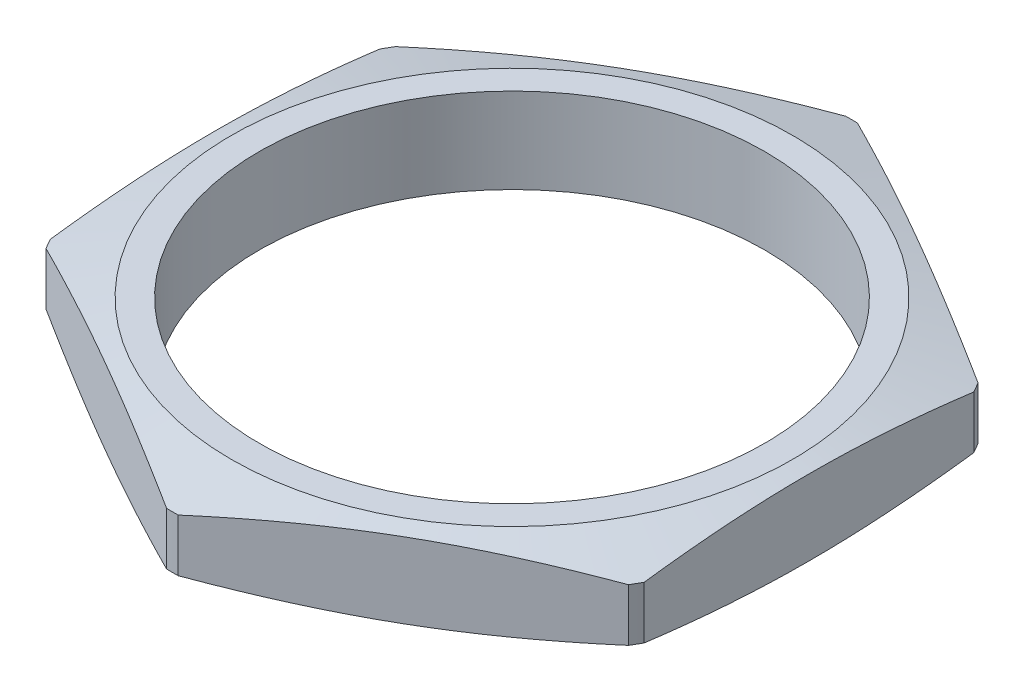
ISO-10303-21;
HEADER;
FILE_DESCRIPTION(('STEP AP214'),'2;1');
FILE_NAME('part.step','',(''),(''),'','','');
FILE_SCHEMA(('AUTOMOTIVE_DESIGN { 1 0 10303 214 1 1 1 1 }'));
ENDSEC;
DATA;
#1=APPLICATION_CONTEXT('core data for automotive mechanical design processes');
#2=APPLICATION_PROTOCOL_DEFINITION('international standard','automotive_design',2000,#1);
#3=PRODUCT_CONTEXT('',#1,'mechanical');
#4=PRODUCT('Part','Part','',(#3));
#5=PRODUCT_RELATED_PRODUCT_CATEGORY('part','',(#4));
#6=PRODUCT_DEFINITION_FORMATION('','',#4);
#7=PRODUCT_DEFINITION_CONTEXT('part definition',#1,'design');
#8=PRODUCT_DEFINITION('design','',#6,#7);
#9=PRODUCT_DEFINITION_SHAPE('','',#8);
#10=(LENGTH_UNIT() NAMED_UNIT(*) SI_UNIT(.MILLI.,.METRE.));
#11=(NAMED_UNIT(*) PLANE_ANGLE_UNIT() SI_UNIT($,.RADIAN.));
#12=(NAMED_UNIT(*) SI_UNIT($,.STERADIAN.) SOLID_ANGLE_UNIT());
#13=UNCERTAINTY_MEASURE_WITH_UNIT(LENGTH_MEASURE(1.E-05),#10,'distance_accuracy_value','');
#14=(GEOMETRIC_REPRESENTATION_CONTEXT(3) GLOBAL_UNCERTAINTY_ASSIGNED_CONTEXT((#13)) GLOBAL_UNIT_ASSIGNED_CONTEXT((#10,
#11,#12)) REPRESENTATION_CONTEXT('',''));
#15=CARTESIAN_POINT('',(0.,0.,0.));
#16=DIRECTION('',(0.,0.,1.));
#17=DIRECTION('',(1.,0.,0.));
#18=AXIS2_PLACEMENT_3D('',#15,#16,#17);
#19=CARTESIAN_POINT('',(0.,2.7,0.));
#20=DIRECTION('',(0.,-1.,0.));
#21=DIRECTION('',(0.,0.,-1.));
#22=AXIS2_PLACEMENT_3D('',#19,#20,#21);
#23=CYLINDRICAL_SURFACE('',#22,10.75);
#24=DIRECTION('',(0.,-1.,0.));
#25=VECTOR('',#24,1.);
#26=CARTESIAN_POINT('',(9.21684347747406,2.7,-5.53283799796667));
#27=LINE('',#26,#25);
#28=CARTESIAN_POINT('',(9.21684347747406,2.2,-5.53283799796667));
#29=VERTEX_POINT('',#28);
#30=CARTESIAN_POINT('',(9.21684347747406,0.535898384862248,-5.53283799796668));
#31=VERTEX_POINT('',#30);
#32=EDGE_CURVE('E369',#29,#31,#27,.T.);
#33=ORIENTED_EDGE('',*,*,#32,.F.);
#34=CARTESIAN_POINT('',(0.,2.2,0.));
#35=DIRECTION('',(0.,1.,0.));
#36=DIRECTION('',(0.,0.,1.));
#37=AXIS2_PLACEMENT_3D('',#34,#35,#36);
#38=CIRCLE('',#37,10.75);
#39=CARTESIAN_POINT('',(9.39999999999999,2.2,-5.21560159521412));
#40=VERTEX_POINT('',#39);
#41=EDGE_CURVE('E350',#29,#40,#38,.F.);
#42=ORIENTED_EDGE('',*,*,#41,.T.);
#43=DIRECTION('',(0.,-1.,0.));
#44=VECTOR('',#43,1.);
#45=CARTESIAN_POINT('',(9.39999999999999,2.7,-5.21560159521412));
#46=LINE('',#45,#44);
#47=CARTESIAN_POINT('',(9.4,0.535898384862248,-5.21560159521412));
#48=VERTEX_POINT('',#47);
#49=EDGE_CURVE('E381',#48,#40,#46,.F.);
#50=ORIENTED_EDGE('',*,*,#49,.F.);
#51=CARTESIAN_POINT('',(0.,0.535898384862248,0.));
#52=DIRECTION('',(0.,1.,0.));
#53=DIRECTION('',(0.,0.,1.));
#54=AXIS2_PLACEMENT_3D('',#51,#52,#53);
#55=CIRCLE('',#54,10.75);
#56=EDGE_CURVE('E173',#48,#31,#55,.T.);
#57=ORIENTED_EDGE('',*,*,#56,.T.);
#58=EDGE_LOOP('',(#33,#42,#50,#57));
#59=FACE_BOUND('',#58,.T.);
#60=ADVANCED_FACE('F46',(#59),#23,.T.);
#61=DIRECTION('',(0.,-1.,0.));
#62=VECTOR('',#61,1.);
#63=CARTESIAN_POINT('',(0.183156522525941,2.7,-10.7484395931808));
#64=LINE('',#63,#62);
#65=CARTESIAN_POINT('',(0.183156522525943,0.535898384862248,-10.7484395931808));
#66=VERTEX_POINT('',#65);
#67=CARTESIAN_POINT('',(0.183156522525941,2.2,-10.7484395931808));
#68=VERTEX_POINT('',#67);
#69=EDGE_CURVE('E269',#66,#68,#64,.F.);
#70=ORIENTED_EDGE('',*,*,#69,.F.);
#71=CARTESIAN_POINT('',(-0.183156522525944,0.535898384862248,-10.7484395931808));
#72=VERTEX_POINT('',#71);
#73=EDGE_CURVE('E168',#66,#72,#55,.T.);
#74=ORIENTED_EDGE('',*,*,#73,.T.);
#75=DIRECTION('',(0.,-1.,0.));
#76=VECTOR('',#75,1.);
#77=CARTESIAN_POINT('',(-0.183156522525941,2.7,-10.7484395931808));
#78=LINE('',#77,#76);
#79=CARTESIAN_POINT('',(-0.183156522525941,2.2,-10.7484395931808));
#80=VERTEX_POINT('',#79);
#81=EDGE_CURVE('E148',#80,#72,#78,.T.);
#82=ORIENTED_EDGE('',*,*,#81,.F.);
#83=EDGE_CURVE('E341',#80,#68,#38,.F.);
#84=ORIENTED_EDGE('',*,*,#83,.T.);
#85=EDGE_LOOP('',(#70,#74,#82,#84));
#86=FACE_BOUND('',#85,.T.);
#87=ADVANCED_FACE('F309',(#86),#23,.T.);
#88=DIRECTION('',(0.,-1.,0.));
#89=VECTOR('',#88,1.);
#90=CARTESIAN_POINT('',(9.39999999999999,2.7,5.21560159521412));
#91=LINE('',#90,#89);
#92=CARTESIAN_POINT('',(9.39999999999999,2.2,5.21560159521412));
#93=VERTEX_POINT('',#92);
#94=CARTESIAN_POINT('',(9.4,0.535898384862248,5.21560159521412));
#95=VERTEX_POINT('',#94);
#96=EDGE_CURVE('E270',#93,#95,#91,.T.);
#97=ORIENTED_EDGE('',*,*,#96,.F.);
#98=CARTESIAN_POINT('',(9.21684347747406,2.2,5.53283799796667));
#99=VERTEX_POINT('',#98);
#100=EDGE_CURVE('E343',#93,#99,#38,.F.);
#101=ORIENTED_EDGE('',*,*,#100,.T.);
#102=DIRECTION('',(0.,-1.,0.));
#103=VECTOR('',#102,1.);
#104=CARTESIAN_POINT('',(9.21684347747406,2.7,5.53283799796667));
#105=LINE('',#104,#103);
#106=CARTESIAN_POINT('',(9.21684347747406,0.535898384862248,5.53283799796667));
#107=VERTEX_POINT('',#106);
#108=EDGE_CURVE('E391',#107,#99,#105,.F.);
#109=ORIENTED_EDGE('',*,*,#108,.F.);
#110=EDGE_CURVE('E181',#107,#95,#55,.T.);
#111=ORIENTED_EDGE('',*,*,#110,.T.);
#112=EDGE_LOOP('',(#97,#101,#109,#111));
#113=FACE_BOUND('',#112,.T.);
#114=ADVANCED_FACE('F314',(#113),#23,.T.);
#115=DIRECTION('',(0.,-1.,0.));
#116=VECTOR('',#115,1.);
#117=CARTESIAN_POINT('',(0.183156522525933,2.7,10.7484395931808));
#118=LINE('',#117,#116);
#119=CARTESIAN_POINT('',(0.183156522525933,2.2,10.7484395931808));
#120=VERTEX_POINT('',#119);
#121=CARTESIAN_POINT('',(0.183156522525938,0.535898384862248,10.7484395931808));
#122=VERTEX_POINT('',#121);
#123=EDGE_CURVE('E397',#120,#122,#118,.T.);
#124=ORIENTED_EDGE('',*,*,#123,.F.);
#125=CARTESIAN_POINT('',(-0.183156522525942,2.2,10.7484395931808));
#126=VERTEX_POINT('',#125);
#127=EDGE_CURVE('E182',#120,#126,#38,.F.);
#128=ORIENTED_EDGE('',*,*,#127,.T.);
#129=DIRECTION('',(0.,-1.,0.));
#130=VECTOR('',#129,1.);
#131=CARTESIAN_POINT('',(-0.183156522525942,2.7,10.7484395931808));
#132=LINE('',#131,#130);
#133=CARTESIAN_POINT('',(-0.183156522525943,0.535898384862247,10.7484395931808));
#134=VERTEX_POINT('',#133);
#135=EDGE_CURVE('E332',#134,#126,#132,.F.);
#136=ORIENTED_EDGE('',*,*,#135,.F.);
#137=EDGE_CURVE('E175',#134,#122,#55,.T.);
#138=ORIENTED_EDGE('',*,*,#137,.T.);
#139=EDGE_LOOP('',(#124,#128,#136,#138));
#140=FACE_BOUND('',#139,.T.);
#141=ADVANCED_FACE('F322',(#140),#23,.T.);
#142=DIRECTION('',(0.,-1.,0.));
#143=VECTOR('',#142,1.);
#144=CARTESIAN_POINT('',(-9.21684347747406,2.7,5.53283799796667));
#145=LINE('',#144,#143);
#146=CARTESIAN_POINT('',(-9.21684347747406,2.2,5.53283799796667));
#147=VERTEX_POINT('',#146);
#148=CARTESIAN_POINT('',(-9.21684347747406,0.535898384862248,5.53283799796667));
#149=VERTEX_POINT('',#148);
#150=EDGE_CURVE('E69',#147,#149,#145,.T.);
#151=ORIENTED_EDGE('',*,*,#150,.F.);
#152=CARTESIAN_POINT('',(-9.4,2.2,5.21560159521411));
#153=VERTEX_POINT('',#152);
#154=EDGE_CURVE('E180',#147,#153,#38,.F.);
#155=ORIENTED_EDGE('',*,*,#154,.T.);
#156=DIRECTION('',(0.,-1.,0.));
#157=VECTOR('',#156,1.);
#158=CARTESIAN_POINT('',(-9.4,2.7,5.21560159521411));
#159=LINE('',#158,#157);
#160=CARTESIAN_POINT('',(-9.4,0.535898384862248,5.21560159521411));
#161=VERTEX_POINT('',#160);
#162=EDGE_CURVE('E217',#161,#153,#159,.F.);
#163=ORIENTED_EDGE('',*,*,#162,.F.);
#164=EDGE_CURVE('E169',#161,#149,#55,.T.);
#165=ORIENTED_EDGE('',*,*,#164,.T.);
#166=EDGE_LOOP('',(#151,#155,#163,#165));
#167=FACE_BOUND('',#166,.T.);
#168=ADVANCED_FACE('F318',(#167),#23,.T.);
#169=DIRECTION('',(0.,-1.,0.));
#170=VECTOR('',#169,1.);
#171=CARTESIAN_POINT('',(-9.4,2.7,-5.21560159521411));
#172=LINE('',#171,#170);
#173=CARTESIAN_POINT('',(-9.4,2.2,-5.21560159521411));
#174=VERTEX_POINT('',#173);
#175=CARTESIAN_POINT('',(-9.4,0.535898384862248,-5.21560159521411));
#176=VERTEX_POINT('',#175);
#177=EDGE_CURVE('E77',#174,#176,#172,.T.);
#178=ORIENTED_EDGE('',*,*,#177,.F.);
#179=CARTESIAN_POINT('',(-9.21684347747406,2.2,-5.53283799796667));
#180=VERTEX_POINT('',#179);
#181=EDGE_CURVE('E163',#174,#180,#38,.F.);
#182=ORIENTED_EDGE('',*,*,#181,.T.);
#183=DIRECTION('',(0.,-1.,0.));
#184=VECTOR('',#183,1.);
#185=CARTESIAN_POINT('',(-9.21684347747406,2.7,-5.53283799796667));
#186=LINE('',#185,#184);
#187=CARTESIAN_POINT('',(-9.21684347747406,0.535898384862248,-5.53283799796667));
#188=VERTEX_POINT('',#187);
#189=EDGE_CURVE('E145',#188,#180,#186,.F.);
#190=ORIENTED_EDGE('',*,*,#189,.F.);
#191=EDGE_CURVE('E161',#188,#176,#55,.T.);
#192=ORIENTED_EDGE('',*,*,#191,.T.);
#193=EDGE_LOOP('',(#178,#182,#190,#192));
#194=FACE_BOUND('',#193,.T.);
#195=ADVANCED_FACE('F160',(#194),#23,.T.);
#196=CARTESIAN_POINT('',(0.,2.7,0.));
#197=DIRECTION('',(0.,-1.,0.));
#198=DIRECTION('',(0.,0.,-1.));
#199=AXIS2_PLACEMENT_3D('',#196,#197,#198);
#200=CONICAL_SURFACE('',#199,8.88397459621558,1.30899693899575);
#201=CARTESIAN_POINT('',(0.,2.7,0.));
#202=DIRECTION('',(0.,1.,0.));
#203=DIRECTION('',(0.,0.,1.));
#204=AXIS2_PLACEMENT_3D('',#201,#202,#203);
#205=CIRCLE('',#204,8.88397459621558);
#206=CARTESIAN_POINT('',(0.,2.7,8.88397459621558));
#207=VERTEX_POINT('',#206);
#208=EDGE_CURVE('E344',#207,#207,#205,.T.);
#209=ORIENTED_EDGE('',*,*,#208,.F.);
#210=EDGE_LOOP('',(#209));
#211=FACE_BOUND('',#210,.T.);
#212=ORIENTED_EDGE('',*,*,#41,.F.);
#213=CARTESIAN_POINT('',(9.21817565857168,2.19979999999985,-5.53206886285135));
#214=CARTESIAN_POINT('',(8.84285593275891,2.25617954736137,-5.74875980758153));
#215=CARTESIAN_POINT('',(8.46688465815857,2.30724528726111,-5.9658269241796));
#216=CARTESIAN_POINT('',(7.7136957121978,2.39682133169059,-6.4006807648807));
#217=CARTESIAN_POINT('',(7.33647764725926,2.43532719201803,-6.61846771621616));
#218=CARTESIAN_POINT('',(6.58293661259939,2.49766256051647,-7.05352483542247));
#219=CARTESIAN_POINT('',(6.20661808338529,2.52156186810128,-7.27079243956527));
#220=CARTESIAN_POINT('',(5.45353297873627,2.55359496638114,-7.70558632745708));
#221=CARTESIAN_POINT('',(5.07676648936839,2.56173140978201,-7.92311256151526));
#222=CARTESIAN_POINT('',(4.32323351063263,2.56173140978203,-8.35816502963161));
#223=CARTESIAN_POINT('',(3.94646702126476,2.55359496638117,-8.57569126368978));
#224=CARTESIAN_POINT('',(3.19338191661573,2.52156186810134,-9.01048515158159));
#225=CARTESIAN_POINT('',(2.81706338740163,2.49766256051654,-9.2277527557244));
#226=CARTESIAN_POINT('',(2.06352235274176,2.43532719201813,-9.6628098749307));
#227=CARTESIAN_POINT('',(1.68630428780321,2.3968213316907,-9.88059682626616));
#228=CARTESIAN_POINT('',(0.933115341842445,2.30724528726124,-10.3154506669673));
#229=CARTESIAN_POINT('',(0.557144067242105,2.25617954736151,-10.5325177835653));
#230=CARTESIAN_POINT('',(0.181824341429333,2.1998,-10.7492087282955));
#231=B_SPLINE_CURVE_WITH_KNOTS('',3,(#213,#214,#215,#216,#217,#218,#219,#220,#221,#222,#223,
#224,#225,#226,#227,#228,#229,#230),.UNSPECIFIED.,.F.,.F.,(4,2,2,2,2,2,2,2,4),(0.,
1.31115977516494,2.62278299059983,3.92808840162309,5.23317412591315,6.53825985020321,
7.84356526122646,9.15518847666135,10.4663482518263),.UNSPECIFIED.);
#232=EDGE_CURVE('E362',#29,#68,#231,.T.);
#233=ORIENTED_EDGE('',*,*,#232,.T.);
#234=ORIENTED_EDGE('',*,*,#83,.F.);
#235=CARTESIAN_POINT('',(-0.181824341429335,2.1998,-10.7492087282955));
#236=CARTESIAN_POINT('',(-0.557144067242108,2.25617954736151,-10.5325177835653));
#237=CARTESIAN_POINT('',(-0.933115341842449,2.30724528726124,-10.3154506669673));
#238=CARTESIAN_POINT('',(-1.68630428780322,2.3968213316907,-9.88059682626616));
#239=CARTESIAN_POINT('',(-2.06352235274177,2.43532719201813,-9.6628098749307));
#240=CARTESIAN_POINT('',(-2.81706338740163,2.49766256051654,-9.2277527557244));
#241=CARTESIAN_POINT('',(-3.19338191661574,2.52156186810134,-9.01048515158159));
#242=CARTESIAN_POINT('',(-3.94646702126476,2.55359496638117,-8.57569126368978));
#243=CARTESIAN_POINT('',(-4.32323351063264,2.56173140978203,-8.35816502963161));
#244=CARTESIAN_POINT('',(-5.07676648936839,2.56173140978201,-7.92311256151526));
#245=CARTESIAN_POINT('',(-5.45353297873627,2.55359496638114,-7.70558632745708));
#246=CARTESIAN_POINT('',(-6.20661808338529,2.52156186810128,-7.27079243956527));
#247=CARTESIAN_POINT('',(-6.58293661259939,2.49766256051647,-7.05352483542247));
#248=CARTESIAN_POINT('',(-7.33647764725926,2.43532719201803,-6.61846771621617));
#249=CARTESIAN_POINT('',(-7.71369571219781,2.39682133169059,-6.4006807648807));
#250=CARTESIAN_POINT('',(-8.46688465815857,2.30724528726111,-5.9658269241796));
#251=CARTESIAN_POINT('',(-8.84285593275891,2.25617954736136,-5.74875980758153));
#252=CARTESIAN_POINT('',(-9.21817565857168,2.19979999999985,-5.53206886285135));
#253=B_SPLINE_CURVE_WITH_KNOTS('',3,(#235,#236,#237,#238,#239,#240,#241,#242,#243,#244,#245,
#246,#247,#248,#249,#250,#251,#252),.UNSPECIFIED.,.F.,.F.,(4,2,2,2,2,2,2,2,4),(0.,
1.31115977516494,2.62278299059984,3.92808840162309,5.23317412591315,6.53825985020321,
7.84356526122646,9.15518847666135,10.4663482518263),.UNSPECIFIED.);
#254=EDGE_CURVE('E209',#80,#180,#253,.T.);
#255=ORIENTED_EDGE('',*,*,#254,.T.);
#256=ORIENTED_EDGE('',*,*,#181,.F.);
#257=CARTESIAN_POINT('',(-9.4,0.0402913971668657,-16.2929877834868));
#258=CARTESIAN_POINT('',(-9.4,0.131948907352564,-15.8980144268586));
#259=CARTESIAN_POINT('',(-9.4,0.222840393615614,-15.5028615003231));
#260=CARTESIAN_POINT('',(-9.4,0.402745157805587,-14.7121216981159));
#261=CARTESIAN_POINT('',(-9.4,0.491758404463756,-14.3165348153349));
#262=CARTESIAN_POINT('',(-9.4,0.667575658993785,-13.5247834563603));
#263=CARTESIAN_POINT('',(-9.4,0.754379205550519,-13.1286188775206));
#264=CARTESIAN_POINT('',(-9.4,0.925303142436334,-12.3357116097779));
#265=CARTESIAN_POINT('',(-9.4,1.00942354178585,-11.9389689228231));
#266=CARTESIAN_POINT('',(-9.4,1.17518690057416,-11.1411228842426));
#267=CARTESIAN_POINT('',(-9.4,1.25679962354083,-10.740013233621));
#268=CARTESIAN_POINT('',(-9.4,1.41600070863396,-9.93699679154388));
#269=CARTESIAN_POINT('',(-9.4,1.4935891041085,-9.53509000672261));
#270=CARTESIAN_POINT('',(-9.4,1.64385492432274,-8.73031196645773));
#271=CARTESIAN_POINT('',(-9.4,1.71653183596713,-8.32744061478535));
#272=CARTESIAN_POINT('',(-9.4,1.85586508558543,-7.52065201944612));
#273=CARTESIAN_POINT('',(-9.4,1.9225214263472,-7.11673477626365));
#274=CARTESIAN_POINT('',(-9.4,2.04679588917835,-6.31862022101853));
#275=CARTESIAN_POINT('',(-9.4,2.10460878186919,-5.92445344789568));
#276=CARTESIAN_POINT('',(-9.4,2.21186746932486,-5.13497265623331));
#277=CARTESIAN_POINT('',(-9.4,2.26131326679699,-4.73965863806503));
#278=CARTESIAN_POINT('',(-9.4,2.35029240342197,-3.9480089900364));
#279=CARTESIAN_POINT('',(-9.4,2.38982834461796,-3.5516736560152));
#280=CARTESIAN_POINT('',(-9.4,2.4574890151694,-2.75802170707514));
#281=CARTESIAN_POINT('',(-9.4,2.48561389445317,-2.36070510511801));
#282=CARTESIAN_POINT('',(-9.4,2.52908169615286,-1.56708715698945));
#283=CARTESIAN_POINT('',(-9.4,2.54447941365033,-1.17078885946876));
#284=CARTESIAN_POINT('',(-9.4,2.56192040757687,-0.377895183385455));
#285=CARTESIAN_POINT('',(-9.4,2.56396373734748,0.0187001939842057));
#286=CARTESIAN_POINT('',(-9.4,2.55458671479372,0.81176028898685));
#287=CARTESIAN_POINT('',(-9.4,2.54316532862296,1.20822499424846));
#288=CARTESIAN_POINT('',(-9.4,2.50744959332257,2.00056039698522));
#289=CARTESIAN_POINT('',(-9.4,2.48315526970385,2.39643109563599));
#290=CARTESIAN_POINT('',(-9.4,2.40995679198722,3.35588004723408));
#291=CARTESIAN_POINT('',(-9.4,2.35497616841449,3.9189946353878));
#292=CARTESIAN_POINT('',(-9.4,2.22541048491539,5.04287413671415));
#293=CARTESIAN_POINT('',(-9.4,2.15082622147521,5.60363914440888));
#294=CARTESIAN_POINT('',(-9.4,1.98612941500019,6.72464579835983));
#295=CARTESIAN_POINT('',(-9.4,1.89596895548622,7.2848803010385));
#296=CARTESIAN_POINT('',(-9.4,1.70396046981207,8.40331578338519));
#297=CARTESIAN_POINT('',(-9.4,1.60211250235808,8.96151677325297));
#298=CARTESIAN_POINT('',(-9.4,1.38741409090439,10.0876179020433));
#299=CARTESIAN_POINT('',(-9.4,1.27438126989891,10.655483006204));
#300=CARTESIAN_POINT('',(-9.4,1.04137802764768,11.7897861015187));
#301=CARTESIAN_POINT('',(-9.4,0.921407530883618,12.3562240770681));
#302=CARTESIAN_POINT('',(-9.4,0.676837782139774,13.4849161501699));
#303=CARTESIAN_POINT('',(-9.4,0.552266801782215,14.0471763950469));
#304=CARTESIAN_POINT('',(-9.4,0.362379227403672,14.8898610632136));
#305=CARTESIAN_POINT('',(-9.4,0.29858034424472,15.1706290670438));
#306=CARTESIAN_POINT('',(-9.4,0.170082842648603,15.7319577954584));
#307=CARTESIAN_POINT('',(-9.4,0.105384228408237,16.0125185210034));
#308=CARTESIAN_POINT('',(-9.4,0.0402913971668662,16.2929877834868));
#309=B_SPLINE_CURVE_WITH_KNOTS('',3,(#257,#258,#259,#260,#261,#262,#263,#264,#265,#266,#267,
#268,#269,#270,#271,#272,#273,#274,#275,#276,#277,#278,#279,#280,#281,#282,#283,#284,#285,#286,
#287,#288,#289,#290,#291,#292,#293,#294,#295,#296,#297,#298,#299,#300,#301,#302,#303,#304,#305,
#306,#307,#308),.UNSPECIFIED.,.F.,.F.,(4,2,2,2,2,2,2,2,2,2,2,2,2,2,2,2,2,2,2,2,2,2,2,2,2,4),(0.,
1.21640864830064,2.43283753130567,3.6495183172138,4.86619501234889,6.09416292377924,
7.3221206578789,8.55020647719324,9.77829172783431,10.9733694684506,12.1684468223815,
13.363210053894,14.5579575870745,15.7475341008772,16.9371058631411,18.1267689689269,
19.3164297171103,21.0133489161472,22.7101991808514,24.4123655056298,26.1145232808263,
27.8514825733796,29.5884607767233,31.3161244338548,32.1798991607187,33.0436698598511),.UNSPECIFIED.);
#310=EDGE_CURVE('E234',#174,#153,#309,.T.);
#311=ORIENTED_EDGE('',*,*,#310,.T.);
#312=ORIENTED_EDGE('',*,*,#154,.F.);
#313=CARTESIAN_POINT('',(-9.21817565857168,2.19979999999985,5.53206886285135));
#314=CARTESIAN_POINT('',(-8.84285593275891,2.25617954736137,5.74875980758153));
#315=CARTESIAN_POINT('',(-8.46688465815857,2.30724528726111,5.9658269241796));
#316=CARTESIAN_POINT('',(-7.7136957121978,2.39682133169059,6.4006807648807));
#317=CARTESIAN_POINT('',(-7.33647764725925,2.43532719201803,6.61846771621616));
#318=CARTESIAN_POINT('',(-6.58293661259939,2.49766256051647,7.05352483542247));
#319=CARTESIAN_POINT('',(-6.20661808338529,2.52156186810128,7.27079243956527));
#320=CARTESIAN_POINT('',(-5.45353297873627,2.55359496638114,7.70558632745708));
#321=CARTESIAN_POINT('',(-5.07676648936839,2.56173140978201,7.92311256151526));
#322=CARTESIAN_POINT('',(-4.32323351063263,2.56173140978203,8.35816502963161));
#323=CARTESIAN_POINT('',(-3.94646702126476,2.55359496638117,8.57569126368978));
#324=CARTESIAN_POINT('',(-3.19338191661573,2.52156186810134,9.01048515158159));
#325=CARTESIAN_POINT('',(-2.81706338740163,2.49766256051654,9.2277527557244));
#326=CARTESIAN_POINT('',(-2.06352235274176,2.43532719201813,9.6628098749307));
#327=CARTESIAN_POINT('',(-1.68630428780321,2.3968213316907,9.88059682626616));
#328=CARTESIAN_POINT('',(-0.933115341842444,2.30724528726124,10.3154506669673));
#329=CARTESIAN_POINT('',(-0.557144067242103,2.25617954736151,10.5325177835653));
#330=CARTESIAN_POINT('',(-0.181824341429331,2.1998,10.7492087282955));
#331=B_SPLINE_CURVE_WITH_KNOTS('',3,(#313,#314,#315,#316,#317,#318,#319,#320,#321,#322,#323,
#324,#325,#326,#327,#328,#329,#330),.UNSPECIFIED.,.F.,.F.,(4,2,2,2,2,2,2,2,4),(0.,
1.31115977516494,2.62278299059983,3.92808840162309,5.23317412591315,6.53825985020321,
7.84356526122646,9.15518847666135,10.4663482518263),.UNSPECIFIED.);
#332=EDGE_CURVE('E242',#147,#126,#331,.T.);
#333=ORIENTED_EDGE('',*,*,#332,.T.);
#334=ORIENTED_EDGE('',*,*,#127,.F.);
#335=CARTESIAN_POINT('',(0.18182434142933,2.1998,10.7492087282955));
#336=CARTESIAN_POINT('',(0.557144067242101,2.25617954736151,10.5325177835653));
#337=CARTESIAN_POINT('',(0.933115341842443,2.30724528726124,10.3154506669673));
#338=CARTESIAN_POINT('',(1.68630428780321,2.3968213316907,9.88059682626616));
#339=CARTESIAN_POINT('',(2.06352235274176,2.43532719201813,9.6628098749307));
#340=CARTESIAN_POINT('',(2.81706338740163,2.49766256051654,9.2277527557244));
#341=CARTESIAN_POINT('',(3.19338191661573,2.52156186810134,9.01048515158159));
#342=CARTESIAN_POINT('',(3.94646702126476,2.55359496638117,8.57569126368978));
#343=CARTESIAN_POINT('',(4.32323351063263,2.56173140978203,8.35816502963161));
#344=CARTESIAN_POINT('',(5.07676648936839,2.56173140978201,7.92311256151526));
#345=CARTESIAN_POINT('',(5.45353297873626,2.55359496638114,7.70558632745708));
#346=CARTESIAN_POINT('',(6.20661808338529,2.52156186810128,7.27079243956527));
#347=CARTESIAN_POINT('',(6.58293661259939,2.49766256051647,7.05352483542247));
#348=CARTESIAN_POINT('',(7.33647764725925,2.43532719201803,6.61846771621617));
#349=CARTESIAN_POINT('',(7.7136957121978,2.39682133169059,6.40068076488071));
#350=CARTESIAN_POINT('',(8.46688465815857,2.30724528726111,5.96582692417961));
#351=CARTESIAN_POINT('',(8.84285593275891,2.25617954736137,5.74875980758154));
#352=CARTESIAN_POINT('',(9.21817565857168,2.19979999999985,5.53206886285135));
#353=B_SPLINE_CURVE_WITH_KNOTS('',3,(#335,#336,#337,#338,#339,#340,#341,#342,#343,#344,#345,
#346,#347,#348,#349,#350,#351,#352),.UNSPECIFIED.,.F.,.F.,(4,2,2,2,2,2,2,2,4),(0.,
1.31115977516494,2.62278299059984,3.92808840162309,5.23317412591315,6.53825985020321,
7.84356526122646,9.15518847666135,10.4663482518263),.UNSPECIFIED.);
#354=EDGE_CURVE('E250',#120,#99,#353,.T.);
#355=ORIENTED_EDGE('',*,*,#354,.T.);
#356=ORIENTED_EDGE('',*,*,#100,.F.);
#357=CARTESIAN_POINT('',(9.4,0.0402913971668642,16.2929877834868));
#358=CARTESIAN_POINT('',(9.4,0.131948907352563,15.8980144268587));
#359=CARTESIAN_POINT('',(9.4,0.222840393615612,15.5028615003231));
#360=CARTESIAN_POINT('',(9.4,0.402745157805585,14.7121216981159));
#361=CARTESIAN_POINT('',(9.4,0.491758404463754,14.3165348153349));
#362=CARTESIAN_POINT('',(9.4,0.667575658993784,13.5247834563603));
#363=CARTESIAN_POINT('',(9.4,0.754379205550518,13.1286188775206));
#364=CARTESIAN_POINT('',(9.4,0.925303142436333,12.3357116097779));
#365=CARTESIAN_POINT('',(9.4,1.00942354178585,11.9389689228231));
#366=CARTESIAN_POINT('',(9.4,1.17518690057416,11.1411228842426));
#367=CARTESIAN_POINT('',(9.4,1.25679962354083,10.740013233621));
#368=CARTESIAN_POINT('',(9.4,1.41600070863396,9.93699679154388));
#369=CARTESIAN_POINT('',(9.4,1.4935891041085,9.53509000672262));
#370=CARTESIAN_POINT('',(9.4,1.64385492432273,8.73031196645774));
#371=CARTESIAN_POINT('',(9.4,1.71653183596713,8.32744061478536));
#372=CARTESIAN_POINT('',(9.4,1.85586508558543,7.52065201944612));
#373=CARTESIAN_POINT('',(9.4,1.9225214263472,7.11673477626366));
#374=CARTESIAN_POINT('',(9.4,2.04679588917835,6.31862022101853));
#375=CARTESIAN_POINT('',(9.4,2.10460878186919,5.92445344789569));
#376=CARTESIAN_POINT('',(9.4,2.21186746932486,5.13497265623332));
#377=CARTESIAN_POINT('',(9.4,2.26131326679699,4.73965863806504));
#378=CARTESIAN_POINT('',(9.4,2.35029240342197,3.9480089900364));
#379=CARTESIAN_POINT('',(9.4,2.38982834461796,3.55167365601521));
#380=CARTESIAN_POINT('',(9.4,2.45748901516941,2.75802170707514));
#381=CARTESIAN_POINT('',(9.4,2.48561389445317,2.36070510511802));
#382=CARTESIAN_POINT('',(9.4,2.52908169615286,1.56708715698945));
#383=CARTESIAN_POINT('',(9.4,2.54447941365033,1.17078885946877));
#384=CARTESIAN_POINT('',(9.4,2.56192040757687,0.377895183385462));
#385=CARTESIAN_POINT('',(9.4,2.56396373734748,-0.0187001939841994));
#386=CARTESIAN_POINT('',(9.4,2.55458671479372,-0.811760288986845));
#387=CARTESIAN_POINT('',(9.4,2.54316532862296,-1.20822499424846));
#388=CARTESIAN_POINT('',(9.4,2.50744959332257,-2.00056039698522));
#389=CARTESIAN_POINT('',(9.4,2.48315526970385,-2.39643109563598));
#390=CARTESIAN_POINT('',(9.4,2.40995679198722,-3.35588004723407));
#391=CARTESIAN_POINT('',(9.4,2.35497616841449,-3.9189946353878));
#392=CARTESIAN_POINT('',(9.4,2.22541048491539,-5.04287413671415));
#393=CARTESIAN_POINT('',(9.4,2.15082622147521,-5.60363914440888));
#394=CARTESIAN_POINT('',(9.4,1.98612941500019,-6.72464579835983));
#395=CARTESIAN_POINT('',(9.4,1.89596895548622,-7.2848803010385));
#396=CARTESIAN_POINT('',(9.4,1.70396046981207,-8.40331578338519));
#397=CARTESIAN_POINT('',(9.4,1.60211250235808,-8.96151677325298));
#398=CARTESIAN_POINT('',(9.4,1.38741409090439,-10.0876179020433));
#399=CARTESIAN_POINT('',(9.4,1.27438126989891,-10.655483006204));
#400=CARTESIAN_POINT('',(9.4,1.04137802764768,-11.7897861015187));
#401=CARTESIAN_POINT('',(9.4,0.921407530883616,-12.3562240770681));
#402=CARTESIAN_POINT('',(9.4,0.676837782139772,-13.4849161501699));
#403=CARTESIAN_POINT('',(9.4,0.552266801782214,-14.0471763950469));
#404=CARTESIAN_POINT('',(9.4,0.362379227403672,-14.8898610632136));
#405=CARTESIAN_POINT('',(9.4,0.29858034424472,-15.1706290670438));
#406=CARTESIAN_POINT('',(9.4,0.170082842648601,-15.7319577954584));
#407=CARTESIAN_POINT('',(9.4,0.105384228408235,-16.0125185210034));
#408=CARTESIAN_POINT('',(9.4,0.0402913971668636,-16.2929877834868));
#409=B_SPLINE_CURVE_WITH_KNOTS('',3,(#357,#358,#359,#360,#361,#362,#363,#364,#365,#366,#367,
#368,#369,#370,#371,#372,#373,#374,#375,#376,#377,#378,#379,#380,#381,#382,#383,#384,#385,#386,
#387,#388,#389,#390,#391,#392,#393,#394,#395,#396,#397,#398,#399,#400,#401,#402,#403,#404,#405,
#406,#407,#408),.UNSPECIFIED.,.F.,.F.,(4,2,2,2,2,2,2,2,2,2,2,2,2,2,2,2,2,2,2,2,2,2,2,2,2,4),(0.,
1.21640864830064,2.43283753130567,3.64951831721381,4.86619501234889,6.09416292377925,
7.3221206578789,8.55020647719324,9.77829172783432,10.9733694684506,12.1684468223815,
13.363210053894,14.5579575870745,15.7475341008772,16.9371058631411,18.1267689689269,
19.3164297171103,21.0133489161472,22.7101991808514,24.4123655056298,26.1145232808263,
27.8514825733796,29.5884607767233,31.3161244338548,32.1798991607187,33.0436698598511),.UNSPECIFIED.);
#410=EDGE_CURVE('E259',#93,#40,#409,.T.);
#411=ORIENTED_EDGE('',*,*,#410,.T.);
#412=EDGE_LOOP('',(#212,#233,#234,#255,#256,#311,#312,#333,#334,#355,#356,#411));
#413=FACE_BOUND('',#412,.T.);
#414=ADVANCED_FACE('F220',(#211,#413),#200,.T.);
#415=CARTESIAN_POINT('',(0.,0.535898384862248,0.));
#416=DIRECTION('',(0.,1.,0.));
#417=DIRECTION('',(0.,0.,1.));
#418=AXIS2_PLACEMENT_3D('',#415,#416,#417);
#419=CONICAL_SURFACE('',#418,10.75,1.30899693899575);
#420=CARTESIAN_POINT('',(0.,0.,0.));
#421=DIRECTION('',(0.,1.,0.));
#422=DIRECTION('',(0.,0.,1.));
#423=AXIS2_PLACEMENT_3D('',#420,#421,#422);
#424=CIRCLE('',#423,8.74999999999997);
#425=CARTESIAN_POINT('',(0.,0.,8.74999999999997));
#426=VERTEX_POINT('',#425);
#427=EDGE_CURVE('E155',#426,#426,#424,.F.);
#428=ORIENTED_EDGE('',*,*,#427,.F.);
#429=EDGE_LOOP('',(#428));
#430=FACE_BOUND('',#429,.T.);
#431=ORIENTED_EDGE('',*,*,#73,.F.);
#432=CARTESIAN_POINT('',(0.181824341429334,0.536098384862248,-10.7492087282955));
#433=CARTESIAN_POINT('',(0.557144067242106,0.479718837500744,-10.5325177835653));
#434=CARTESIAN_POINT('',(0.933115341842446,0.42865309760101,-10.3154506669673));
#435=CARTESIAN_POINT('',(1.68630428780322,0.339077053171557,-9.88059682626616));
#436=CARTESIAN_POINT('',(2.06352235274176,0.300571192844124,-9.6628098749307));
#437=CARTESIAN_POINT('',(2.81706338740163,0.238235824345714,-9.2277527557244));
#438=CARTESIAN_POINT('',(3.19338191661573,0.214336516760919,-9.01048515158159));
#439=CARTESIAN_POINT('',(3.94646702126476,0.182303418481084,-8.57569126368978));
#440=CARTESIAN_POINT('',(4.32323351063263,0.17416697508023,-8.35816502963161));
#441=CARTESIAN_POINT('',(5.07676648936839,0.174166975080244,-7.92311256151526));
#442=CARTESIAN_POINT('',(5.45353297873627,0.182303418481113,-7.70558632745708));
#443=CARTESIAN_POINT('',(6.20661808338529,0.214336516760977,-7.27079243956527));
#444=CARTESIAN_POINT('',(6.58293661259939,0.238235824345785,-7.05352483542247));
#445=CARTESIAN_POINT('',(7.33647764725925,0.300571192844222,-6.61846771621617));
#446=CARTESIAN_POINT('',(7.7136957121978,0.339077053171666,-6.4006807648807));
#447=CARTESIAN_POINT('',(8.46688465815857,0.428653097601142,-5.9658269241796));
#448=CARTESIAN_POINT('',(8.84285593275891,0.479718837500886,-5.74875980758153));
#449=CARTESIAN_POINT('',(9.21817565857168,0.5360983848624,-5.53206886285135));
#450=B_SPLINE_CURVE_WITH_KNOTS('',3,(#432,#433,#434,#435,#436,#437,#438,#439,#440,#441,#442,
#443,#444,#445,#446,#447,#448,#449),.UNSPECIFIED.,.F.,.F.,(4,2,2,2,2,2,2,2,4),(0.,
1.31115977516494,2.62278299059983,3.92808840162309,5.23317412591315,6.53825985020321,
7.84356526122646,9.15518847666135,10.4663482518263),.UNSPECIFIED.);
#451=EDGE_CURVE('E12',#66,#31,#450,.T.);
#452=ORIENTED_EDGE('',*,*,#451,.T.);
#453=ORIENTED_EDGE('',*,*,#56,.F.);
#454=CARTESIAN_POINT('',(9.4,2.69600412177257,-16.2946988636449));
#455=CARTESIAN_POINT('',(9.4,2.60433716395088,-15.899695159342));
#456=CARTESIAN_POINT('',(9.4,2.51343616290401,-15.5045118964283));
#457=CARTESIAN_POINT('',(9.4,2.3335122166858,-14.7137114446263));
#458=CARTESIAN_POINT('',(9.4,2.24448930277223,-14.318094248631));
#459=CARTESIAN_POINT('',(9.4,2.06865255122096,-13.5262823261093));
#460=CARTESIAN_POINT('',(9.4,1.98183917459301,-13.1300874970014));
#461=CARTESIAN_POINT('',(9.4,1.81089538789815,-12.3371197464573));
#462=CARTESIAN_POINT('',(9.4,1.72676496881409,-11.9403468269686));
#463=CARTESIAN_POINT('',(9.4,1.5609810979268,-11.1424392099874));
#464=CARTESIAN_POINT('',(9.4,1.47935788765565,-10.7412982121537));
#465=CARTESIAN_POINT('',(9.4,1.32013563567044,-9.93821906992216));
#466=CARTESIAN_POINT('',(9.4,1.24253656061621,-9.53628093215734));
#467=CARTESIAN_POINT('',(9.4,1.09224920707754,-8.73144012988771));
#468=CARTESIAN_POINT('',(9.4,1.01956144197153,-8.3285373690948));
#469=CARTESIAN_POINT('',(9.4,0.880206381798708,-7.52168589154719));
#470=CARTESIAN_POINT('',(9.4,0.813539083947498,-7.11773717527632));
#471=CARTESIAN_POINT('',(9.4,0.689243199659662,-6.31956150566759));
#472=CARTESIAN_POINT('',(9.4,0.63141982245946,-5.92536509734282));
#473=CARTESIAN_POINT('',(9.4,0.524140351156114,-5.13582487319497));
#474=CARTESIAN_POINT('',(9.4,0.474684254366017,-4.7404810577404));
#475=CARTESIAN_POINT('',(9.4,0.385685018269069,-3.94877160887791));
#476=CARTESIAN_POINT('',(9.4,0.346139276497992,-3.55240627140157));
#477=CARTESIAN_POINT('',(9.4,0.278459925670747,-2.75869403878015));
#478=CARTESIAN_POINT('',(9.4,0.250326166655243,-2.36134715660211));
#479=CARTESIAN_POINT('',(9.4,0.206842082127027,-1.56766886386865));
#480=CARTESIAN_POINT('',(9.4,0.191436943481585,-1.17134050388355));
#481=CARTESIAN_POINT('',(9.4,0.173982955258877,-0.378386464294748));
#482=CARTESIAN_POINT('',(9.4,0.171934052225384,0.0182392141126364));
#483=CARTESIAN_POINT('',(9.4,0.181302086815215,0.81136003687477));
#484=CARTESIAN_POINT('',(9.4,0.19272005783143,1.20785516887642));
#485=CARTESIAN_POINT('',(9.4,0.228431192602405,2.00025144306797));
#486=CARTESIAN_POINT('',(9.4,0.252724330908562,2.39615258643036));
#487=CARTESIAN_POINT('',(9.4,0.325925373548542,3.35571346834501));
#488=CARTESIAN_POINT('',(9.4,0.380912443265474,3.91890937520808));
#489=CARTESIAN_POINT('',(9.4,0.510496688772564,5.0429508595318));
#490=CARTESIAN_POINT('',(9.4,0.585093069220707,5.6037965313795));
#491=CARTESIAN_POINT('',(9.4,0.749818048226946,6.7249646977503));
#492=CARTESIAN_POINT('',(9.4,0.839994590813631,7.28528004437208));
#493=CARTESIAN_POINT('',(9.4,1.03203767826183,8.40387669718656));
#494=CARTESIAN_POINT('',(9.4,1.13390416408201,8.96215801363765));
#495=CARTESIAN_POINT('',(9.4,1.34864183451092,10.0884229132915));
#496=CARTESIAN_POINT('',(9.4,1.46169545624983,10.6563714488388));
#497=CARTESIAN_POINT('',(9.4,1.69474124494145,11.7908411644187));
#498=CARTESIAN_POINT('',(9.4,1.81473348746627,12.3573623288348));
#499=CARTESIAN_POINT('',(9.4,2.05934695700461,13.4862192525442));
#500=CARTESIAN_POINT('',(9.4,2.18393990087643,14.0485611618691));
#501=CARTESIAN_POINT('',(9.4,2.37386064232446,14.8913682504639));
#502=CARTESIAN_POINT('',(9.4,2.43767061742428,15.1721770455679));
#503=CARTESIAN_POINT('',(9.4,2.56619035956465,15.7335873376893));
#504=CARTESIAN_POINT('',(9.4,2.63090012240831,16.0141888356672));
#505=CARTESIAN_POINT('',(9.4,2.69600412177257,16.2946988636449));
#506=B_SPLINE_CURVE_WITH_KNOTS('',3,(#454,#455,#456,#457,#458,#459,#460,#461,#462,#463,#464,
#465,#466,#467,#468,#469,#470,#471,#472,#473,#474,#475,#476,#477,#478,#479,#480,#481,#482,#483,
#484,#485,#486,#487,#488,#489,#490,#491,#492,#493,#494,#495,#496,#497,#498,#499,#500,#501,#502,
#503,#504,#505),.UNSPECIFIED.,.F.,.F.,(4,2,2,2,2,2,2,2,2,2,2,2,2,2,2,2,2,2,2,2,2,2,2,2,2,4),(0.,
1.21650374133561,2.43302771348761,3.64980346082396,4.86657511827068,6.09464145923962,
7.32269762398909,8.55088195928852,9.77906572656361,10.974236000455,12.1694058905451,
13.3642615987662,14.5591016054588,15.7487690656729,16.9384317644276,18.1281857589767,
19.3179374019086,21.0151010645078,22.7121959017733,24.4146092922468,26.1170140848727,
27.8542310288426,29.591466897305,31.3193839998377,32.1832854319013,33.0471828357878),.UNSPECIFIED.);
#507=EDGE_CURVE('E62',#48,#95,#506,.T.);
#508=ORIENTED_EDGE('',*,*,#507,.T.);
#509=ORIENTED_EDGE('',*,*,#110,.F.);
#510=CARTESIAN_POINT('',(9.21817565857168,0.5360983848624,5.53206886285135));
#511=CARTESIAN_POINT('',(8.84285593275891,0.479718837500886,5.74875980758154));
#512=CARTESIAN_POINT('',(8.46688465815857,0.428653097601142,5.96582692417961));
#513=CARTESIAN_POINT('',(7.7136957121978,0.339077053171666,6.40068076488071));
#514=CARTESIAN_POINT('',(7.33647764725925,0.300571192844222,6.61846771621617));
#515=CARTESIAN_POINT('',(6.58293661259939,0.238235824345785,7.05352483542247));
#516=CARTESIAN_POINT('',(6.20661808338529,0.214336516760977,7.27079243956527));
#517=CARTESIAN_POINT('',(5.45353297873626,0.182303418481113,7.70558632745708));
#518=CARTESIAN_POINT('',(5.07676648936839,0.174166975080244,7.92311256151526));
#519=CARTESIAN_POINT('',(4.32323351063263,0.17416697508023,8.35816502963161));
#520=CARTESIAN_POINT('',(3.94646702126476,0.182303418481084,8.57569126368978));
#521=CARTESIAN_POINT('',(3.19338191661573,0.214336516760919,9.01048515158159));
#522=CARTESIAN_POINT('',(2.81706338740163,0.238235824345714,9.2277527557244));
#523=CARTESIAN_POINT('',(2.06352235274176,0.300571192844124,9.6628098749307));
#524=CARTESIAN_POINT('',(1.68630428780321,0.339077053171557,9.88059682626616));
#525=CARTESIAN_POINT('',(0.933115341842443,0.428653097601011,10.3154506669673));
#526=CARTESIAN_POINT('',(0.557144067242102,0.479718837500744,10.5325177835653));
#527=CARTESIAN_POINT('',(0.18182434142933,0.536098384862248,10.7492087282955));
#528=B_SPLINE_CURVE_WITH_KNOTS('',3,(#510,#511,#512,#513,#514,#515,#516,#517,#518,#519,#520,
#521,#522,#523,#524,#525,#526,#527),.UNSPECIFIED.,.F.,.F.,(4,2,2,2,2,2,2,2,4),(0.,
1.31115977516494,2.62278299059983,3.92808840162309,5.23317412591315,6.5382598502032,
7.84356526122646,9.15518847666135,10.4663482518263),.UNSPECIFIED.);
#529=EDGE_CURVE('E286',#107,#122,#528,.T.);
#530=ORIENTED_EDGE('',*,*,#529,.T.);
#531=ORIENTED_EDGE('',*,*,#137,.F.);
#532=CARTESIAN_POINT('',(-0.181824341429332,0.536098384862248,10.7492087282955));
#533=CARTESIAN_POINT('',(-0.557144067242105,0.479718837500744,10.5325177835653));
#534=CARTESIAN_POINT('',(-0.933115341842446,0.428653097601011,10.3154506669673));
#535=CARTESIAN_POINT('',(-1.68630428780321,0.339077053171557,9.88059682626616));
#536=CARTESIAN_POINT('',(-2.06352235274176,0.300571192844124,9.6628098749307));
#537=CARTESIAN_POINT('',(-2.81706338740163,0.238235824345713,9.2277527557244));
#538=CARTESIAN_POINT('',(-3.19338191661573,0.214336516760919,9.01048515158159));
#539=CARTESIAN_POINT('',(-3.94646702126476,0.182303418481083,8.57569126368978));
#540=CARTESIAN_POINT('',(-4.32323351063264,0.17416697508023,8.35816502963161));
#541=CARTESIAN_POINT('',(-5.07676648936839,0.174166975080245,7.92311256151526));
#542=CARTESIAN_POINT('',(-5.45353297873627,0.182303418481113,7.70558632745708));
#543=CARTESIAN_POINT('',(-6.20661808338529,0.214336516760977,7.27079243956527));
#544=CARTESIAN_POINT('',(-6.58293661259939,0.238235824345785,7.05352483542247));
#545=CARTESIAN_POINT('',(-7.33647764725925,0.300571192844222,6.61846771621616));
#546=CARTESIAN_POINT('',(-7.7136957121978,0.339077053171666,6.4006807648807));
#547=CARTESIAN_POINT('',(-8.46688465815857,0.428653097601142,5.9658269241796));
#548=CARTESIAN_POINT('',(-8.84285593275891,0.479718837500886,5.74875980758153));
#549=CARTESIAN_POINT('',(-9.21817565857168,0.5360983848624,5.53206886285135));
#550=B_SPLINE_CURVE_WITH_KNOTS('',3,(#532,#533,#534,#535,#536,#537,#538,#539,#540,#541,#542,
#543,#544,#545,#546,#547,#548,#549),.UNSPECIFIED.,.F.,.F.,(4,2,2,2,2,2,2,2,4),(0.,
1.31115977516494,2.62278299059984,3.92808840162309,5.23317412591315,6.53825985020321,
7.84356526122646,9.15518847666135,10.4663482518263),.UNSPECIFIED.);
#551=EDGE_CURVE('E293',#134,#149,#550,.T.);
#552=ORIENTED_EDGE('',*,*,#551,.T.);
#553=ORIENTED_EDGE('',*,*,#164,.F.);
#554=CARTESIAN_POINT('',(-9.4,2.69600412177256,16.2946988636449));
#555=CARTESIAN_POINT('',(-9.4,2.60433716395088,15.8996951593419));
#556=CARTESIAN_POINT('',(-9.4,2.51343616290401,15.5045118964283));
#557=CARTESIAN_POINT('',(-9.4,2.3335122166858,14.7137114446263));
#558=CARTESIAN_POINT('',(-9.4,2.24448930277223,14.3180942486309));
#559=CARTESIAN_POINT('',(-9.4,2.06865255122096,13.5262823261093));
#560=CARTESIAN_POINT('',(-9.4,1.98183917459301,13.1300874970014));
#561=CARTESIAN_POINT('',(-9.4,1.81089538789815,12.3371197464573));
#562=CARTESIAN_POINT('',(-9.4,1.72676496881408,11.9403468269686));
#563=CARTESIAN_POINT('',(-9.4,1.5609810979268,11.1424392099874));
#564=CARTESIAN_POINT('',(-9.4,1.47935788765565,10.7412982121537));
#565=CARTESIAN_POINT('',(-9.4,1.32013563567044,9.93821906992215));
#566=CARTESIAN_POINT('',(-9.4,1.24253656061621,9.53628093215733));
#567=CARTESIAN_POINT('',(-9.4,1.09224920707754,8.7314401298877));
#568=CARTESIAN_POINT('',(-9.4,1.01956144197153,8.32853736909479));
#569=CARTESIAN_POINT('',(-9.4,0.880206381798708,7.52168589154718));
#570=CARTESIAN_POINT('',(-9.4,0.813539083947497,7.11773717527631));
#571=CARTESIAN_POINT('',(-9.4,0.689243199659662,6.31956150566759));
#572=CARTESIAN_POINT('',(-9.4,0.63141982245946,5.92536509734281));
#573=CARTESIAN_POINT('',(-9.4,0.524140351156114,5.13582487319496));
#574=CARTESIAN_POINT('',(-9.4,0.474684254366018,4.74048105774039));
#575=CARTESIAN_POINT('',(-9.4,0.38568501826907,3.9487716088779));
#576=CARTESIAN_POINT('',(-9.4,0.346139276497993,3.55240627140156));
#577=CARTESIAN_POINT('',(-9.4,0.278459925670748,2.75869403878015));
#578=CARTESIAN_POINT('',(-9.4,0.250326166655244,2.36134715660211));
#579=CARTESIAN_POINT('',(-9.4,0.206842082127028,1.56766886386864));
#580=CARTESIAN_POINT('',(-9.4,0.191436943481586,1.17134050388354));
#581=CARTESIAN_POINT('',(-9.4,0.173982955258879,0.378386464294738));
#582=CARTESIAN_POINT('',(-9.4,0.171934052225386,-0.018239214112646));
#583=CARTESIAN_POINT('',(-9.4,0.181302086815217,-0.81136003687478));
#584=CARTESIAN_POINT('',(-9.4,0.192720057831431,-1.20785516887643));
#585=CARTESIAN_POINT('',(-9.4,0.228431192602407,-2.00025144306797));
#586=CARTESIAN_POINT('',(-9.4,0.252724330908564,-2.39615258643037));
#587=CARTESIAN_POINT('',(-9.4,0.325925373548544,-3.35571346834502));
#588=CARTESIAN_POINT('',(-9.4,0.380912443265476,-3.91890937520809));
#589=CARTESIAN_POINT('',(-9.4,0.510496688772566,-5.0429508595318));
#590=CARTESIAN_POINT('',(-9.4,0.585093069220709,-5.60379653137951));
#591=CARTESIAN_POINT('',(-9.4,0.749818048226948,-6.7249646977503));
#592=CARTESIAN_POINT('',(-9.4,0.839994590813633,-7.28528004437208));
#593=CARTESIAN_POINT('',(-9.4,1.03203767826184,-8.40387669718656));
#594=CARTESIAN_POINT('',(-9.4,1.13390416408201,-8.96215801363765));
#595=CARTESIAN_POINT('',(-9.4,1.34864183451092,-10.0884229132914));
#596=CARTESIAN_POINT('',(-9.4,1.46169545624983,-10.6563714488388));
#597=CARTESIAN_POINT('',(-9.4,1.69474124494145,-11.7908411644187));
#598=CARTESIAN_POINT('',(-9.4,1.81473348746626,-12.3573623288348));
#599=CARTESIAN_POINT('',(-9.4,2.0593469570046,-13.4862192525442));
#600=CARTESIAN_POINT('',(-9.4,2.18393990087643,-14.048561161869));
#601=CARTESIAN_POINT('',(-9.4,2.37386064232446,-14.8913682504639));
#602=CARTESIAN_POINT('',(-9.4,2.43767061742427,-15.1721770455679));
#603=CARTESIAN_POINT('',(-9.4,2.56619035956465,-15.7335873376893));
#604=CARTESIAN_POINT('',(-9.4,2.6309001224083,-16.0141888356672));
#605=CARTESIAN_POINT('',(-9.4,2.69600412177257,-16.2946988636449));
#606=B_SPLINE_CURVE_WITH_KNOTS('',3,(#554,#555,#556,#557,#558,#559,#560,#561,#562,#563,#564,
#565,#566,#567,#568,#569,#570,#571,#572,#573,#574,#575,#576,#577,#578,#579,#580,#581,#582,#583,
#584,#585,#586,#587,#588,#589,#590,#591,#592,#593,#594,#595,#596,#597,#598,#599,#600,#601,#602,
#603,#604,#605),.UNSPECIFIED.,.F.,.F.,(4,2,2,2,2,2,2,2,2,2,2,2,2,2,2,2,2,2,2,2,2,2,2,2,2,4),(0.,
1.21650374133561,2.43302771348761,3.64980346082396,4.86657511827068,6.09464145923961,
7.32269762398909,8.55088195928852,9.77906572656361,10.974236000455,12.1694058905451,
13.3642615987662,14.5591016054588,15.7487690656729,16.9384317644276,18.1281857589767,
19.3179374019086,21.0151010645078,22.7121959017733,24.4146092922468,26.1170140848727,
27.8542310288426,29.5914668973049,31.3193839998376,32.1832854319013,33.0471828357878),.UNSPECIFIED.);
#607=EDGE_CURVE('E154',#161,#176,#606,.T.);
#608=ORIENTED_EDGE('',*,*,#607,.T.);
#609=ORIENTED_EDGE('',*,*,#191,.F.);
#610=CARTESIAN_POINT('',(-9.21817565857168,0.5360983848624,-5.53206886285135));
#611=CARTESIAN_POINT('',(-8.84285593275891,0.479718837500887,-5.74875980758153));
#612=CARTESIAN_POINT('',(-8.46688465815857,0.428653097601143,-5.96582692417961));
#613=CARTESIAN_POINT('',(-7.7136957121978,0.339077053171667,-6.40068076488071));
#614=CARTESIAN_POINT('',(-7.33647764725925,0.300571192844222,-6.61846771621617));
#615=CARTESIAN_POINT('',(-6.58293661259939,0.238235824345785,-7.05352483542247));
#616=CARTESIAN_POINT('',(-6.20661808338529,0.214336516760977,-7.27079243956527));
#617=CARTESIAN_POINT('',(-5.45353297873627,0.182303418481113,-7.70558632745708));
#618=CARTESIAN_POINT('',(-5.07676648936839,0.174166975080244,-7.92311256151526));
#619=CARTESIAN_POINT('',(-4.32323351063264,0.17416697508023,-8.35816502963161));
#620=CARTESIAN_POINT('',(-3.94646702126476,0.182303418481084,-8.57569126368978));
#621=CARTESIAN_POINT('',(-3.19338191661573,0.21433651676092,-9.01048515158159));
#622=CARTESIAN_POINT('',(-2.81706338740163,0.238235824345714,-9.2277527557244));
#623=CARTESIAN_POINT('',(-2.06352235274177,0.300571192844124,-9.6628098749307));
#624=CARTESIAN_POINT('',(-1.68630428780322,0.339077053171557,-9.88059682626616));
#625=CARTESIAN_POINT('',(-0.933115341842448,0.42865309760101,-10.3154506669673));
#626=CARTESIAN_POINT('',(-0.557144067242108,0.479718837500744,-10.5325177835653));
#627=CARTESIAN_POINT('',(-0.181824341429336,0.536098384862248,-10.7492087282955));
#628=B_SPLINE_CURVE_WITH_KNOTS('',3,(#610,#611,#612,#613,#614,#615,#616,#617,#618,#619,#620,
#621,#622,#623,#624,#625,#626,#627),.UNSPECIFIED.,.F.,.F.,(4,2,2,2,2,2,2,2,4),(0.,
1.31115977516494,2.62278299059983,3.92808840162309,5.23317412591314,6.5382598502032,
7.84356526122646,9.15518847666135,10.4663482518263),.UNSPECIFIED.);
#629=EDGE_CURVE('E142',#188,#72,#628,.T.);
#630=ORIENTED_EDGE('',*,*,#629,.T.);
#631=EDGE_LOOP('',(#431,#452,#453,#508,#509,#530,#531,#552,#553,#608,#609,#630));
#632=FACE_BOUND('',#631,.T.);
#633=ADVANCED_FACE('F49',(#430,#632),#419,.T.);
#634=CARTESIAN_POINT('',(0.,2.7,0.));
#635=DIRECTION('',(0.,1.,0.));
#636=DIRECTION('',(0.,0.,1.));
#637=AXIS2_PLACEMENT_3D('',#634,#635,#636);
#638=PLANE('',#637);
#639=ORIENTED_EDGE('',*,*,#208,.T.);
#640=EDGE_LOOP('',(#639));
#641=FACE_BOUND('',#640,.T.);
#642=CARTESIAN_POINT('',(0.,2.7,0.));
#643=DIRECTION('',(0.,1.,0.));
#644=DIRECTION('',(0.,0.,1.));
#645=AXIS2_PLACEMENT_3D('',#642,#643,#644);
#646=CIRCLE('',#645,8.);
#647=CARTESIAN_POINT('',(0.,2.7,-8.));
#648=VERTEX_POINT('',#647);
#649=EDGE_CURVE('E352',#648,#648,#646,.T.);
#650=ORIENTED_EDGE('',*,*,#649,.F.);
#651=EDGE_LOOP('',(#650));
#652=FACE_BOUND('',#651,.T.);
#653=ADVANCED_FACE('F443',(#641,#652),#638,.T.);
#654=CARTESIAN_POINT('',(0.,0.,0.));
#655=DIRECTION('',(0.,1.,0.));
#656=DIRECTION('',(0.,0.,1.));
#657=AXIS2_PLACEMENT_3D('',#654,#655,#656);
#658=PLANE('',#657);
#659=ORIENTED_EDGE('',*,*,#427,.T.);
#660=EDGE_LOOP('',(#659));
#661=FACE_BOUND('',#660,.T.);
#662=CARTESIAN_POINT('',(0.,0.,0.));
#663=DIRECTION('',(0.,1.,0.));
#664=DIRECTION('',(0.,0.,1.));
#665=AXIS2_PLACEMENT_3D('',#662,#663,#664);
#666=CIRCLE('',#665,8.);
#667=CARTESIAN_POINT('',(0.,0.,-8.));
#668=VERTEX_POINT('',#667);
#669=EDGE_CURVE('E357',#668,#668,#666,.T.);
#670=ORIENTED_EDGE('',*,*,#669,.T.);
#671=EDGE_LOOP('',(#670));
#672=FACE_BOUND('',#671,.T.);
#673=ADVANCED_FACE('F515',(#661,#672),#658,.F.);
#674=CARTESIAN_POINT('',(0.,2.7,0.));
#675=DIRECTION('',(0.,-1.,0.));
#676=DIRECTION('',(0.,0.,-1.));
#677=AXIS2_PLACEMENT_3D('',#674,#675,#676);
#678=CYLINDRICAL_SURFACE('',#677,8.);
#679=CARTESIAN_POINT('',(0.,2.7,-8.));
#680=CARTESIAN_POINT('',(0.,2.671875,-8.));
#681=CARTESIAN_POINT('',(0.,2.64375,-8.));
#682=CARTESIAN_POINT('',(0.,2.5875,-8.));
#683=CARTESIAN_POINT('',(0.,2.559375,-8.));
#684=CARTESIAN_POINT('',(0.,2.503125,-8.));
#685=CARTESIAN_POINT('',(0.,2.475,-8.));
#686=CARTESIAN_POINT('',(0.,2.41875,-8.));
#687=CARTESIAN_POINT('',(0.,2.390625,-8.));
#688=CARTESIAN_POINT('',(0.,2.334375,-8.));
#689=CARTESIAN_POINT('',(0.,2.30625,-8.));
#690=CARTESIAN_POINT('',(0.,2.25,-8.));
#691=CARTESIAN_POINT('',(0.,2.221875,-8.));
#692=CARTESIAN_POINT('',(0.,2.165625,-8.));
#693=CARTESIAN_POINT('',(0.,2.1375,-8.));
#694=CARTESIAN_POINT('',(0.,2.08125,-8.));
#695=CARTESIAN_POINT('',(0.,2.053125,-8.));
#696=CARTESIAN_POINT('',(0.,1.996875,-8.));
#697=CARTESIAN_POINT('',(0.,1.96875,-8.));
#698=CARTESIAN_POINT('',(0.,1.9125,-8.));
#699=CARTESIAN_POINT('',(0.,1.884375,-8.));
#700=CARTESIAN_POINT('',(0.,1.828125,-8.));
#701=CARTESIAN_POINT('',(0.,1.8,-8.));
#702=CARTESIAN_POINT('',(0.,1.74375,-8.));
#703=CARTESIAN_POINT('',(0.,1.715625,-8.));
#704=CARTESIAN_POINT('',(0.,1.659375,-8.));
#705=CARTESIAN_POINT('',(0.,1.63125,-8.));
#706=CARTESIAN_POINT('',(0.,1.575,-8.));
#707=CARTESIAN_POINT('',(0.,1.546875,-8.));
#708=CARTESIAN_POINT('',(0.,1.490625,-8.));
#709=CARTESIAN_POINT('',(0.,1.4625,-8.));
#710=CARTESIAN_POINT('',(0.,1.40625,-8.));
#711=CARTESIAN_POINT('',(0.,1.378125,-8.));
#712=CARTESIAN_POINT('',(0.,1.321875,-8.));
#713=CARTESIAN_POINT('',(0.,1.29375,-8.));
#714=CARTESIAN_POINT('',(0.,1.2375,-8.));
#715=CARTESIAN_POINT('',(0.,1.209375,-8.));
#716=CARTESIAN_POINT('',(0.,1.153125,-8.));
#717=CARTESIAN_POINT('',(0.,1.125,-8.));
#718=CARTESIAN_POINT('',(0.,1.06875,-8.));
#719=CARTESIAN_POINT('',(0.,1.040625,-8.));
#720=CARTESIAN_POINT('',(0.,0.984375,-8.));
#721=CARTESIAN_POINT('',(0.,0.95625,-8.));
#722=CARTESIAN_POINT('',(0.,0.9,-8.));
#723=CARTESIAN_POINT('',(0.,0.871875,-8.));
#724=CARTESIAN_POINT('',(0.,0.815625,-8.));
#725=CARTESIAN_POINT('',(0.,0.7875,-8.));
#726=CARTESIAN_POINT('',(0.,0.73125,-8.));
#727=CARTESIAN_POINT('',(0.,0.703125,-8.));
#728=CARTESIAN_POINT('',(0.,0.646875,-8.));
#729=CARTESIAN_POINT('',(0.,0.61875,-8.));
#730=CARTESIAN_POINT('',(0.,0.5625,-8.));
#731=CARTESIAN_POINT('',(0.,0.534375,-8.));
#732=CARTESIAN_POINT('',(0.,0.478125,-8.));
#733=CARTESIAN_POINT('',(0.,0.45,-8.));
#734=CARTESIAN_POINT('',(0.,0.39375,-8.));
#735=CARTESIAN_POINT('',(0.,0.365625,-8.));
#736=CARTESIAN_POINT('',(0.,0.309375,-8.));
#737=CARTESIAN_POINT('',(0.,0.28125,-8.));
#738=CARTESIAN_POINT('',(0.,0.225,-8.));
#739=CARTESIAN_POINT('',(0.,0.196875,-8.));
#740=CARTESIAN_POINT('',(0.,0.140625,-8.));
#741=CARTESIAN_POINT('',(0.,0.112499999999999,-8.));
#742=CARTESIAN_POINT('',(0.,0.0562499999999994,-8.));
#743=CARTESIAN_POINT('',(0.,0.0281249999999995,-8.));
#744=CARTESIAN_POINT('',(0.,0.,-8.));
#745=B_SPLINE_CURVE_WITH_KNOTS('',3,(#679,#680,#681,#682,#683,#684,#685,#686,#687,#688,#689,
#690,#691,#692,#693,#694,#695,#696,#697,#698,#699,#700,#701,#702,#703,#704,#705,#706,#707,#708,
#709,#710,#711,#712,#713,#714,#715,#716,#717,#718,#719,#720,#721,#722,#723,#724,#725,#726,#727,
#728,#729,#730,#731,#732,#733,#734,#735,#736,#737,#738,#739,#740,#741,#742,#743,#744),
.UNSPECIFIED.,.F.,.F.,(4,2,2,2,2,2,2,2,2,2,2,2,2,2,2,2,2,2,2,2,2,2,2,2,2,2,2,2,2,2,2,2,4),(0.,
0.0843749999999998,0.16875,0.253125,0.3375,0.421875,0.50625,0.590625,0.675,0.759375,0.84375,
0.928125,1.0125,1.096875,1.18125,1.265625,1.35,1.434375,1.51875,1.603125,1.6875,1.771875,
1.85625,1.940625,2.025,2.109375,2.19375,2.278125,2.3625,2.446875,2.53125,2.615625,2.7),.UNSPECIFIED.);
#746=EDGE_CURVE('BSEAM201',#648,#668,#745,.T.);
#747=ORIENTED_EDGE('',*,*,#649,.T.);
#748=ORIENTED_EDGE('',*,*,#669,.F.);
#749=ORIENTED_EDGE('',*,*,#746,.T.);
#750=ORIENTED_EDGE('',*,*,#746,.F.);
#751=EDGE_LOOP('',(#747,#749,#748,#750));
#752=FACE_BOUND('',#751,.T.);
#753=ADVANCED_FACE('F201',(#752),#678,.F.);
#754=CARTESIAN_POINT('',(0.,0.,-10.854185060765));
#755=DIRECTION('',(-0.5,0.,-0.866025403784439));
#756=DIRECTION('',(-0.866025403784439,0.,0.5));
#757=AXIS2_PLACEMENT_3D('',#754,#755,#756);
#758=PLANE('',#757);
#759=ORIENTED_EDGE('',*,*,#81,.T.);
#760=ORIENTED_EDGE('',*,*,#629,.F.);
#761=ORIENTED_EDGE('',*,*,#189,.T.);
#762=ORIENTED_EDGE('',*,*,#254,.F.);
#763=EDGE_LOOP('',(#759,#760,#761,#762));
#764=FACE_BOUND('',#763,.T.);
#765=ADVANCED_FACE('F144',(#764),#758,.T.);
#766=CARTESIAN_POINT('',(-9.4,0.,-5.42709253038248));
#767=DIRECTION('',(-1.,0.,0.));
#768=DIRECTION('',(0.,0.,1.));
#769=AXIS2_PLACEMENT_3D('',#766,#767,#768);
#770=PLANE('',#769);
#771=ORIENTED_EDGE('',*,*,#177,.T.);
#772=ORIENTED_EDGE('',*,*,#607,.F.);
#773=ORIENTED_EDGE('',*,*,#162,.T.);
#774=ORIENTED_EDGE('',*,*,#310,.F.);
#775=EDGE_LOOP('',(#771,#772,#773,#774));
#776=FACE_BOUND('',#775,.T.);
#777=ADVANCED_FACE('F200',(#776),#770,.T.);
#778=CARTESIAN_POINT('',(-9.4,0.,5.42709253038248));
#779=DIRECTION('',(-0.5,0.,0.866025403784439));
#780=DIRECTION('',(0.866025403784439,0.,0.5));
#781=AXIS2_PLACEMENT_3D('',#778,#779,#780);
#782=PLANE('',#781);
#783=ORIENTED_EDGE('',*,*,#150,.T.);
#784=ORIENTED_EDGE('',*,*,#551,.F.);
#785=ORIENTED_EDGE('',*,*,#135,.T.);
#786=ORIENTED_EDGE('',*,*,#332,.F.);
#787=EDGE_LOOP('',(#783,#784,#785,#786));
#788=FACE_BOUND('',#787,.T.);
#789=ADVANCED_FACE('F299',(#788),#782,.T.);
#790=CARTESIAN_POINT('',(0.,0.,10.854185060765));
#791=DIRECTION('',(0.5,0.,0.866025403784439));
#792=DIRECTION('',(0.866025403784439,0.,-0.5));
#793=AXIS2_PLACEMENT_3D('',#790,#791,#792);
#794=PLANE('',#793);
#795=ORIENTED_EDGE('',*,*,#123,.T.);
#796=ORIENTED_EDGE('',*,*,#529,.F.);
#797=ORIENTED_EDGE('',*,*,#108,.T.);
#798=ORIENTED_EDGE('',*,*,#354,.F.);
#799=EDGE_LOOP('',(#795,#796,#797,#798));
#800=FACE_BOUND('',#799,.T.);
#801=ADVANCED_FACE('F275',(#800),#794,.T.);
#802=CARTESIAN_POINT('',(9.4,0.,5.42709253038249));
#803=DIRECTION('',(1.,0.,0.));
#804=DIRECTION('',(0.,0.,-1.));
#805=AXIS2_PLACEMENT_3D('',#802,#803,#804);
#806=PLANE('',#805);
#807=ORIENTED_EDGE('',*,*,#96,.T.);
#808=ORIENTED_EDGE('',*,*,#507,.F.);
#809=ORIENTED_EDGE('',*,*,#49,.T.);
#810=ORIENTED_EDGE('',*,*,#410,.F.);
#811=EDGE_LOOP('',(#807,#808,#809,#810));
#812=FACE_BOUND('',#811,.T.);
#813=ADVANCED_FACE('F272',(#812),#806,.T.);
#814=CARTESIAN_POINT('',(9.4,0.,-5.42709253038249));
#815=DIRECTION('',(0.5,0.,-0.866025403784439));
#816=DIRECTION('',(-0.866025403784439,0.,-0.5));
#817=AXIS2_PLACEMENT_3D('',#814,#815,#816);
#818=PLANE('',#817);
#819=ORIENTED_EDGE('',*,*,#32,.T.);
#820=ORIENTED_EDGE('',*,*,#451,.F.);
#821=ORIENTED_EDGE('',*,*,#69,.T.);
#822=ORIENTED_EDGE('',*,*,#232,.F.);
#823=EDGE_LOOP('',(#819,#820,#821,#822));
#824=FACE_BOUND('',#823,.T.);
#825=ADVANCED_FACE('F204',(#824),#818,.T.);
#826=CLOSED_SHELL('',(#60,#87,#114,#141,#168,#195,#414,#633,#653,#673,#753,#765,#777,#789,#801,
#813,#825));
#827=MANIFOLD_SOLID_BREP('B2',#826);
#828=ADVANCED_BREP_SHAPE_REPRESENTATION('',(#18,#827),#14);
#829=SHAPE_DEFINITION_REPRESENTATION(#9,#828);
ENDSEC;
END-ISO-10303-21;
